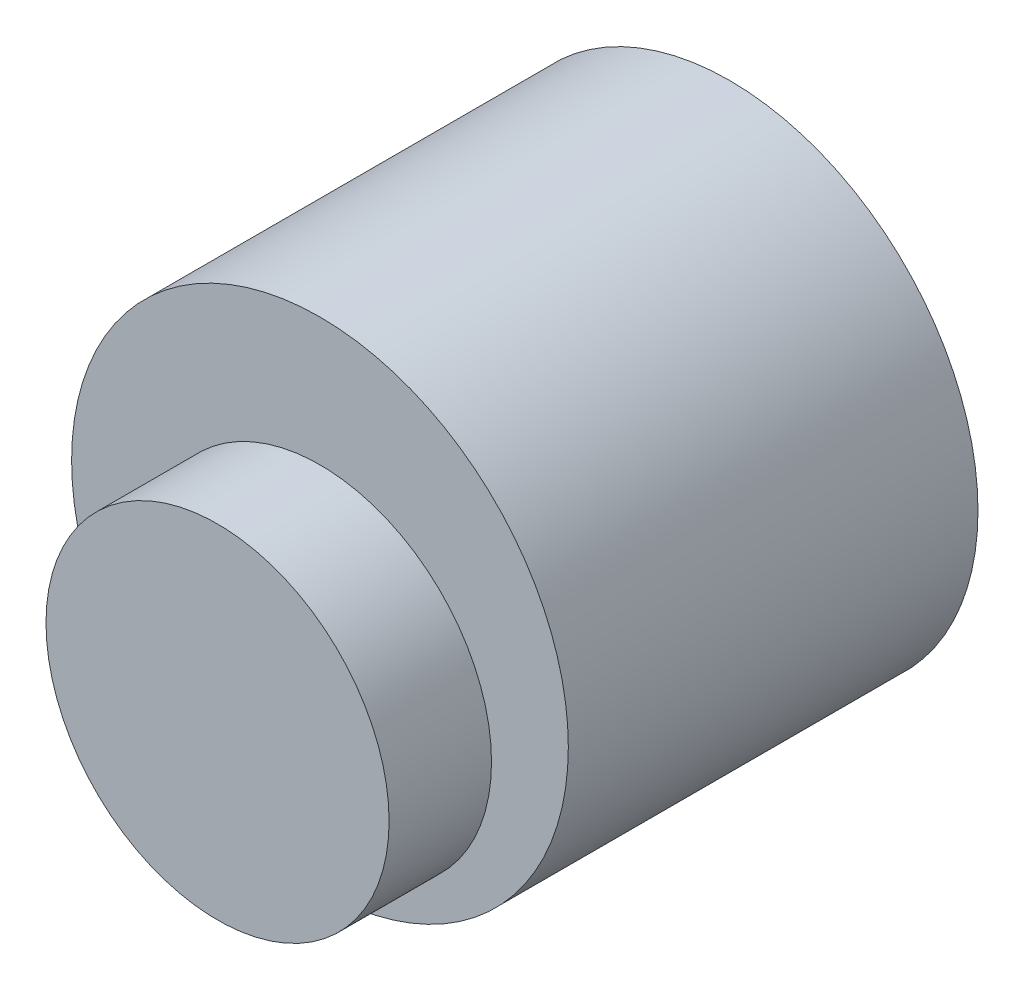
ISO-10303-21;
HEADER;
FILE_DESCRIPTION(('STEP AP214'),'2;1');
FILE_NAME('part.step','',(''),(''),'','','');
FILE_SCHEMA(('AUTOMOTIVE_DESIGN { 1 0 10303 214 1 1 1 1 }'));
ENDSEC;
DATA;
#1=APPLICATION_CONTEXT('core data for automotive mechanical design processes');
#2=APPLICATION_PROTOCOL_DEFINITION('international standard','automotive_design',2000,#1);
#3=PRODUCT_CONTEXT('',#1,'mechanical');
#4=PRODUCT('Part','Part','',(#3));
#5=PRODUCT_RELATED_PRODUCT_CATEGORY('part','',(#4));
#6=PRODUCT_DEFINITION_FORMATION('','',#4);
#7=PRODUCT_DEFINITION_CONTEXT('part definition',#1,'design');
#8=PRODUCT_DEFINITION('design','',#6,#7);
#9=PRODUCT_DEFINITION_SHAPE('','',#8);
#10=(LENGTH_UNIT() NAMED_UNIT(*) SI_UNIT(.MILLI.,.METRE.));
#11=(NAMED_UNIT(*) PLANE_ANGLE_UNIT() SI_UNIT($,.RADIAN.));
#12=(NAMED_UNIT(*) SI_UNIT($,.STERADIAN.) SOLID_ANGLE_UNIT());
#13=UNCERTAINTY_MEASURE_WITH_UNIT(LENGTH_MEASURE(1.E-05),#10,'distance_accuracy_value','');
#14=(GEOMETRIC_REPRESENTATION_CONTEXT(3) GLOBAL_UNCERTAINTY_ASSIGNED_CONTEXT((#13)) GLOBAL_UNIT_ASSIGNED_CONTEXT((#10,
#11,#12)) REPRESENTATION_CONTEXT('',''));
#15=CARTESIAN_POINT('',(0.,0.,0.));
#16=DIRECTION('',(0.,0.,1.));
#17=DIRECTION('',(1.,0.,0.));
#18=AXIS2_PLACEMENT_3D('',#15,#16,#17);
#19=CARTESIAN_POINT('',(0.,0.,8.));
#20=DIRECTION('',(0.,0.,-1.));
#21=DIRECTION('',(-1.,0.,0.));
#22=AXIS2_PLACEMENT_3D('',#19,#20,#21);
#23=CYLINDRICAL_SURFACE('',#22,2.5);
#24=CARTESIAN_POINT('',(0.,0.,0.));
#25=DIRECTION('',(0.,0.,1.));
#26=DIRECTION('',(1.,0.,0.));
#27=AXIS2_PLACEMENT_3D('',#24,#25,#26);
#28=CIRCLE('',#27,2.5);
#29=CARTESIAN_POINT('',(-1.5,2.,0.));
#30=VERTEX_POINT('',#29);
#31=CARTESIAN_POINT('',(1.5,2.,0.));
#32=VERTEX_POINT('',#31);
#33=EDGE_CURVE('E77',#30,#32,#28,.T.);
#34=ORIENTED_EDGE('',*,*,#33,.F.);
#35=DIRECTION('',(0.,0.,-1.));
#36=VECTOR('',#35,1.);
#37=CARTESIAN_POINT('',(-1.5,2.,8.));
#38=LINE('',#37,#36);
#39=CARTESIAN_POINT('',(-1.5,2.,8.));
#40=VERTEX_POINT('',#39);
#41=EDGE_CURVE('E38',#40,#30,#38,.T.);
#42=ORIENTED_EDGE('',*,*,#41,.F.);
#43=CARTESIAN_POINT('',(0.,0.,8.));
#44=DIRECTION('',(0.,0.,1.));
#45=DIRECTION('',(1.,0.,0.));
#46=AXIS2_PLACEMENT_3D('',#43,#44,#45);
#47=CIRCLE('',#46,2.5);
#48=CARTESIAN_POINT('',(1.5,2.,8.));
#49=VERTEX_POINT('',#48);
#50=EDGE_CURVE('E60',#40,#49,#47,.T.);
#51=ORIENTED_EDGE('',*,*,#50,.T.);
#52=DIRECTION('',(0.,0.,-1.));
#53=VECTOR('',#52,1.);
#54=CARTESIAN_POINT('',(1.5,2.,8.));
#55=LINE('',#54,#53);
#56=EDGE_CURVE('E62',#49,#32,#55,.T.);
#57=ORIENTED_EDGE('',*,*,#56,.T.);
#58=EDGE_LOOP('',(#34,#42,#51,#57));
#59=FACE_BOUND('',#58,.T.);
#60=ADVANCED_FACE('F35',(#59),#23,.F.);
#61=CARTESIAN_POINT('',(0.,2.,8.));
#62=DIRECTION('',(0.,1.,0.));
#63=DIRECTION('',(0.,0.,1.));
#64=AXIS2_PLACEMENT_3D('',#61,#62,#63);
#65=PLANE('',#64);
#66=DIRECTION('',(1.,0.,0.));
#67=VECTOR('',#66,1.);
#68=CARTESIAN_POINT('',(0.,2.,0.));
#69=LINE('',#68,#67);
#70=EDGE_CURVE('E69',#30,#32,#69,.T.);
#71=ORIENTED_EDGE('',*,*,#70,.T.);
#72=ORIENTED_EDGE('',*,*,#56,.F.);
#73=DIRECTION('',(1.,0.,0.));
#74=VECTOR('',#73,1.);
#75=CARTESIAN_POINT('',(0.,2.,8.));
#76=LINE('',#75,#74);
#77=EDGE_CURVE('E65',#40,#49,#76,.T.);
#78=ORIENTED_EDGE('',*,*,#77,.F.);
#79=ORIENTED_EDGE('',*,*,#41,.T.);
#80=EDGE_LOOP('',(#71,#72,#78,#79));
#81=FACE_BOUND('',#80,.T.);
#82=ADVANCED_FACE('F68',(#81),#65,.F.);
#83=CARTESIAN_POINT('',(0.,1.,8.));
#84=DIRECTION('',(0.,0.,-1.));
#85=DIRECTION('',(-1.,0.,0.));
#86=AXIS2_PLACEMENT_3D('',#83,#84,#85);
#87=CYLINDRICAL_SURFACE('',#86,4.85);
#88=CARTESIAN_POINT('',(0.,1.,8.));
#89=DIRECTION('',(0.,0.,1.));
#90=DIRECTION('',(1.,0.,0.));
#91=AXIS2_PLACEMENT_3D('',#88,#89,#90);
#92=CIRCLE('',#91,4.85);
#93=CARTESIAN_POINT('',(4.85,1.,8.));
#94=VERTEX_POINT('',#93);
#95=EDGE_CURVE('E71',#94,#94,#92,.T.);
#96=ORIENTED_EDGE('',*,*,#95,.F.);
#97=EDGE_LOOP('',(#96));
#98=FACE_BOUND('',#97,.T.);
#99=CARTESIAN_POINT('',(0.,1.,0.));
#100=DIRECTION('',(0.,0.,1.));
#101=DIRECTION('',(1.,0.,0.));
#102=AXIS2_PLACEMENT_3D('',#99,#100,#101);
#103=CIRCLE('',#102,4.85);
#104=CARTESIAN_POINT('',(4.85,1.,0.));
#105=VERTEX_POINT('',#104);
#106=EDGE_CURVE('E66',#105,#105,#103,.T.);
#107=ORIENTED_EDGE('',*,*,#106,.T.);
#108=EDGE_LOOP('',(#107));
#109=FACE_BOUND('',#108,.T.);
#110=ADVANCED_FACE('F84',(#98,#109),#87,.T.);
#111=CARTESIAN_POINT('',(0.,0.,8.));
#112=DIRECTION('',(0.,0.,1.));
#113=DIRECTION('',(1.,0.,0.));
#114=AXIS2_PLACEMENT_3D('',#111,#112,#113);
#115=PLANE('',#114);
#116=CARTESIAN_POINT('',(0.,0.,8.));
#117=DIRECTION('',(0.,0.,1.));
#118=DIRECTION('',(1.,0.,0.));
#119=AXIS2_PLACEMENT_3D('',#116,#117,#118);
#120=CIRCLE('',#119,3.35);
#121=CARTESIAN_POINT('',(3.35,0.,8.));
#122=VERTEX_POINT('',#121);
#123=EDGE_CURVE('E11',#122,#122,#120,.T.);
#124=ORIENTED_EDGE('',*,*,#123,.F.);
#125=EDGE_LOOP('',(#124));
#126=FACE_BOUND('',#125,.T.);
#127=ORIENTED_EDGE('',*,*,#95,.T.);
#128=EDGE_LOOP('',(#127));
#129=FACE_BOUND('',#128,.T.);
#130=ADVANCED_FACE('F89',(#126,#129),#115,.T.);
#131=CARTESIAN_POINT('',(0.,0.,0.));
#132=DIRECTION('',(0.,0.,1.));
#133=DIRECTION('',(1.,0.,0.));
#134=AXIS2_PLACEMENT_3D('',#131,#132,#133);
#135=PLANE('',#134);
#136=ORIENTED_EDGE('',*,*,#33,.T.);
#137=ORIENTED_EDGE('',*,*,#70,.F.);
#138=EDGE_LOOP('',(#136,#137));
#139=FACE_BOUND('',#138,.T.);
#140=ORIENTED_EDGE('',*,*,#106,.F.);
#141=EDGE_LOOP('',(#140));
#142=FACE_BOUND('',#141,.T.);
#143=ADVANCED_FACE('F86',(#139,#142),#135,.F.);
#144=CARTESIAN_POINT('',(0.,0.,10.));
#145=DIRECTION('',(0.,0.,1.));
#146=DIRECTION('',(1.,0.,0.));
#147=AXIS2_PLACEMENT_3D('',#144,#145,#146);
#148=PLANE('',#147);
#149=CARTESIAN_POINT('',(0.,0.,10.));
#150=DIRECTION('',(0.,0.,1.));
#151=DIRECTION('',(1.,0.,0.));
#152=AXIS2_PLACEMENT_3D('',#149,#150,#151);
#153=CIRCLE('',#152,3.35);
#154=CARTESIAN_POINT('',(3.35,0.,10.));
#155=VERTEX_POINT('',#154);
#156=EDGE_CURVE('E79',#155,#155,#153,.T.);
#157=ORIENTED_EDGE('',*,*,#156,.T.);
#158=EDGE_LOOP('',(#157));
#159=FACE_BOUND('',#158,.T.);
#160=ADVANCED_FACE('F88',(#159),#148,.T.);
#161=CARTESIAN_POINT('',(0.,0.,10.));
#162=DIRECTION('',(0.,0.,-1.));
#163=DIRECTION('',(-1.,0.,0.));
#164=AXIS2_PLACEMENT_3D('',#161,#162,#163);
#165=CYLINDRICAL_SURFACE('',#164,3.35);
#166=ORIENTED_EDGE('',*,*,#156,.F.);
#167=EDGE_LOOP('',(#166));
#168=FACE_BOUND('',#167,.T.);
#169=ORIENTED_EDGE('',*,*,#123,.T.);
#170=EDGE_LOOP('',(#169));
#171=FACE_BOUND('',#170,.T.);
#172=ADVANCED_FACE('F96',(#168,#171),#165,.T.);
#173=CARTESIAN_POINT('',(0.,0.,8.));
#174=DIRECTION('',(0.,0.,1.));
#175=DIRECTION('',(1.,0.,0.));
#176=AXIS2_PLACEMENT_3D('',#173,#174,#175);
#177=PLANE('',#176);
#178=ORIENTED_EDGE('',*,*,#50,.F.);
#179=ORIENTED_EDGE('',*,*,#77,.T.);
#180=EDGE_LOOP('',(#178,#179));
#181=FACE_BOUND('',#180,.T.);
#182=ADVANCED_FACE('F72',(#181),#177,.F.);
#183=CLOSED_SHELL('',(#60,#82,#110,#130,#143,#160,#172,#182));
#184=MANIFOLD_SOLID_BREP('B2',#183);
#185=ADVANCED_BREP_SHAPE_REPRESENTATION('',(#18,#184),#14);
#186=SHAPE_DEFINITION_REPRESENTATION(#9,#185);
ENDSEC;
END-ISO-10303-21;
